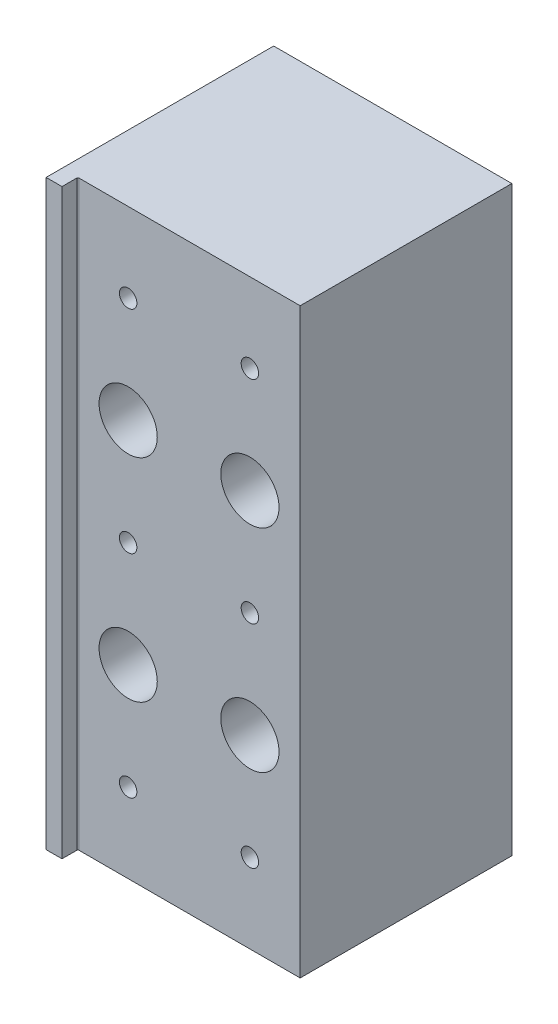
ISO-10303-21;
HEADER;
FILE_DESCRIPTION(('STEP AP214'),'2;1');
FILE_NAME('part.step','',(''),(''),'','','');
FILE_SCHEMA(('AUTOMOTIVE_DESIGN { 1 0 10303 214 1 1 1 1 }'));
ENDSEC;
DATA;
#1=APPLICATION_CONTEXT('core data for automotive mechanical design processes');
#2=APPLICATION_PROTOCOL_DEFINITION('international standard','automotive_design',2000,#1);
#3=PRODUCT_CONTEXT('',#1,'mechanical');
#4=PRODUCT('Part','Part','',(#3));
#5=PRODUCT_RELATED_PRODUCT_CATEGORY('part','',(#4));
#6=PRODUCT_DEFINITION_FORMATION('','',#4);
#7=PRODUCT_DEFINITION_CONTEXT('part definition',#1,'design');
#8=PRODUCT_DEFINITION('design','',#6,#7);
#9=PRODUCT_DEFINITION_SHAPE('','',#8);
#10=(LENGTH_UNIT() NAMED_UNIT(*) SI_UNIT(.MILLI.,.METRE.));
#11=(NAMED_UNIT(*) PLANE_ANGLE_UNIT() SI_UNIT($,.RADIAN.));
#12=(NAMED_UNIT(*) SI_UNIT($,.STERADIAN.) SOLID_ANGLE_UNIT());
#13=UNCERTAINTY_MEASURE_WITH_UNIT(LENGTH_MEASURE(1.E-05),#10,'distance_accuracy_value','');
#14=(GEOMETRIC_REPRESENTATION_CONTEXT(3) GLOBAL_UNCERTAINTY_ASSIGNED_CONTEXT((#13)) GLOBAL_UNIT_ASSIGNED_CONTEXT((#10,
#11,#12)) REPRESENTATION_CONTEXT('',''));
#15=CARTESIAN_POINT('',(0.,0.,0.));
#16=DIRECTION('',(0.,0.,1.));
#17=DIRECTION('',(1.,0.,0.));
#18=AXIS2_PLACEMENT_3D('',#15,#16,#17);
#19=CARTESIAN_POINT('',(45.,110.,40.));
#20=DIRECTION('',(-1.,0.,0.));
#21=DIRECTION('',(0.,0.,1.));
#22=AXIS2_PLACEMENT_3D('',#19,#20,#21);
#23=PLANE('',#22);
#24=DIRECTION('',(0.,0.,-1.));
#25=VECTOR('',#24,1.);
#26=CARTESIAN_POINT('',(45.,0.,40.));
#27=LINE('',#26,#25);
#28=CARTESIAN_POINT('',(45.,0.,40.));
#29=VERTEX_POINT('',#28);
#30=CARTESIAN_POINT('',(45.,0.,0.));
#31=VERTEX_POINT('',#30);
#32=EDGE_CURVE('E220',#29,#31,#27,.T.);
#33=ORIENTED_EDGE('',*,*,#32,.T.);
#34=DIRECTION('',(0.,-1.,0.));
#35=VECTOR('',#34,1.);
#36=CARTESIAN_POINT('',(45.,110.,0.));
#37=LINE('',#36,#35);
#38=CARTESIAN_POINT('',(45.,110.,0.));
#39=VERTEX_POINT('',#38);
#40=EDGE_CURVE('E260',#39,#31,#37,.T.);
#41=ORIENTED_EDGE('',*,*,#40,.F.);
#42=DIRECTION('',(0.,0.,-1.));
#43=VECTOR('',#42,1.);
#44=CARTESIAN_POINT('',(45.,110.,40.));
#45=LINE('',#44,#43);
#46=CARTESIAN_POINT('',(45.,110.,40.));
#47=VERTEX_POINT('',#46);
#48=EDGE_CURVE('E223',#47,#39,#45,.T.);
#49=ORIENTED_EDGE('',*,*,#48,.F.);
#50=DIRECTION('',(0.,-1.,0.));
#51=VECTOR('',#50,1.);
#52=CARTESIAN_POINT('',(45.,110.,40.));
#53=LINE('',#52,#51);
#54=EDGE_CURVE('E237',#47,#29,#53,.T.);
#55=ORIENTED_EDGE('',*,*,#54,.T.);
#56=EDGE_LOOP('',(#33,#41,#49,#55));
#57=FACE_BOUND('',#56,.T.);
#58=ADVANCED_FACE('F54',(#57),#23,.F.);
#59=CARTESIAN_POINT('',(0.,110.,0.));
#60=DIRECTION('',(0.,0.,1.));
#61=DIRECTION('',(1.,0.,0.));
#62=AXIS2_PLACEMENT_3D('',#59,#60,#61);
#63=PLANE('',#62);
#64=CARTESIAN_POINT('',(12.5,35.,0.));
#65=DIRECTION('',(0.,0.,1.));
#66=DIRECTION('',(1.,0.,0.));
#67=AXIS2_PLACEMENT_3D('',#64,#65,#66);
#68=CIRCLE('',#67,3.5);
#69=CARTESIAN_POINT('',(16.,35.,0.));
#70=VERTEX_POINT('',#69);
#71=EDGE_CURVE('E174',#70,#70,#68,.T.);
#72=ORIENTED_EDGE('',*,*,#71,.T.);
#73=EDGE_LOOP('',(#72));
#74=FACE_BOUND('',#73,.T.);
#75=CARTESIAN_POINT('',(35.5,35.,0.));
#76=DIRECTION('',(0.,0.,1.));
#77=DIRECTION('',(1.,0.,0.));
#78=AXIS2_PLACEMENT_3D('',#75,#76,#77);
#79=CIRCLE('',#78,3.5);
#80=CARTESIAN_POINT('',(39.,35.,0.));
#81=VERTEX_POINT('',#80);
#82=EDGE_CURVE('E185',#81,#81,#79,.T.);
#83=ORIENTED_EDGE('',*,*,#82,.T.);
#84=EDGE_LOOP('',(#83));
#85=FACE_BOUND('',#84,.T.);
#86=CARTESIAN_POINT('',(35.5,75.,0.));
#87=DIRECTION('',(0.,0.,1.));
#88=DIRECTION('',(1.,0.,0.));
#89=AXIS2_PLACEMENT_3D('',#86,#87,#88);
#90=CIRCLE('',#89,3.5);
#91=CARTESIAN_POINT('',(39.,75.,0.));
#92=VERTEX_POINT('',#91);
#93=EDGE_CURVE('E179',#92,#92,#90,.T.);
#94=ORIENTED_EDGE('',*,*,#93,.T.);
#95=EDGE_LOOP('',(#94));
#96=FACE_BOUND('',#95,.T.);
#97=CARTESIAN_POINT('',(12.5,75.,0.));
#98=DIRECTION('',(0.,0.,1.));
#99=DIRECTION('',(1.,0.,0.));
#100=AXIS2_PLACEMENT_3D('',#97,#98,#99);
#101=CIRCLE('',#100,3.5);
#102=CARTESIAN_POINT('',(16.,75.,0.));
#103=VERTEX_POINT('',#102);
#104=EDGE_CURVE('E193',#103,#103,#101,.T.);
#105=ORIENTED_EDGE('',*,*,#104,.T.);
#106=EDGE_LOOP('',(#105));
#107=FACE_BOUND('',#106,.T.);
#108=DIRECTION('',(-1.,0.,0.));
#109=VECTOR('',#108,1.);
#110=CARTESIAN_POINT('',(0.,0.,0.));
#111=LINE('',#110,#109);
#112=CARTESIAN_POINT('',(0.,0.,0.));
#113=VERTEX_POINT('',#112);
#114=EDGE_CURVE('E240',#31,#113,#111,.T.);
#115=ORIENTED_EDGE('',*,*,#114,.T.);
#116=DIRECTION('',(0.,-1.,0.));
#117=VECTOR('',#116,1.);
#118=CARTESIAN_POINT('',(0.,110.,0.));
#119=LINE('',#118,#117);
#120=CARTESIAN_POINT('',(0.,110.,0.));
#121=VERTEX_POINT('',#120);
#122=EDGE_CURVE('E257',#121,#113,#119,.T.);
#123=ORIENTED_EDGE('',*,*,#122,.F.);
#124=DIRECTION('',(-1.,0.,0.));
#125=VECTOR('',#124,1.);
#126=CARTESIAN_POINT('',(0.,110.,0.));
#127=LINE('',#126,#125);
#128=EDGE_CURVE('E226',#39,#121,#127,.T.);
#129=ORIENTED_EDGE('',*,*,#128,.F.);
#130=ORIENTED_EDGE('',*,*,#40,.T.);
#131=EDGE_LOOP('',(#115,#123,#129,#130));
#132=FACE_BOUND('',#131,.T.);
#133=ADVANCED_FACE('F293',(#74,#85,#96,#107,#132),#63,.F.);
#134=CARTESIAN_POINT('',(0.,110.,43.));
#135=DIRECTION('',(1.,0.,0.));
#136=DIRECTION('',(0.,0.,-1.));
#137=AXIS2_PLACEMENT_3D('',#134,#135,#136);
#138=PLANE('',#137);
#139=DIRECTION('',(0.,0.,1.));
#140=VECTOR('',#139,1.);
#141=CARTESIAN_POINT('',(0.,0.,43.));
#142=LINE('',#141,#140);
#143=CARTESIAN_POINT('',(0.,0.,43.));
#144=VERTEX_POINT('',#143);
#145=EDGE_CURVE('E242',#113,#144,#142,.T.);
#146=ORIENTED_EDGE('',*,*,#145,.T.);
#147=DIRECTION('',(0.,-1.,0.));
#148=VECTOR('',#147,1.);
#149=CARTESIAN_POINT('',(0.,110.,43.));
#150=LINE('',#149,#148);
#151=CARTESIAN_POINT('',(0.,110.,43.));
#152=VERTEX_POINT('',#151);
#153=EDGE_CURVE('E254',#152,#144,#150,.T.);
#154=ORIENTED_EDGE('',*,*,#153,.F.);
#155=DIRECTION('',(0.,0.,1.));
#156=VECTOR('',#155,1.);
#157=CARTESIAN_POINT('',(0.,110.,43.));
#158=LINE('',#157,#156);
#159=EDGE_CURVE('E229',#121,#152,#158,.T.);
#160=ORIENTED_EDGE('',*,*,#159,.F.);
#161=ORIENTED_EDGE('',*,*,#122,.T.);
#162=EDGE_LOOP('',(#146,#154,#160,#161));
#163=FACE_BOUND('',#162,.T.);
#164=ADVANCED_FACE('F298',(#163),#138,.F.);
#165=CARTESIAN_POINT('',(0.,110.,43.));
#166=DIRECTION('',(0.,0.,-1.));
#167=DIRECTION('',(-1.,0.,0.));
#168=AXIS2_PLACEMENT_3D('',#165,#166,#167);
#169=PLANE('',#168);
#170=DIRECTION('',(1.,0.,0.));
#171=VECTOR('',#170,1.);
#172=CARTESIAN_POINT('',(0.,0.,43.));
#173=LINE('',#172,#171);
#174=CARTESIAN_POINT('',(3.,0.,43.));
#175=VERTEX_POINT('',#174);
#176=EDGE_CURVE('E244',#144,#175,#173,.T.);
#177=ORIENTED_EDGE('',*,*,#176,.T.);
#178=DIRECTION('',(0.,-1.,0.));
#179=VECTOR('',#178,1.);
#180=CARTESIAN_POINT('',(3.,110.,43.));
#181=LINE('',#180,#179);
#182=CARTESIAN_POINT('',(3.,110.,43.));
#183=VERTEX_POINT('',#182);
#184=EDGE_CURVE('E251',#183,#175,#181,.T.);
#185=ORIENTED_EDGE('',*,*,#184,.F.);
#186=DIRECTION('',(1.,0.,0.));
#187=VECTOR('',#186,1.);
#188=CARTESIAN_POINT('',(0.,110.,43.));
#189=LINE('',#188,#187);
#190=EDGE_CURVE('E231',#152,#183,#189,.T.);
#191=ORIENTED_EDGE('',*,*,#190,.F.);
#192=ORIENTED_EDGE('',*,*,#153,.T.);
#193=EDGE_LOOP('',(#177,#185,#191,#192));
#194=FACE_BOUND('',#193,.T.);
#195=ADVANCED_FACE('F303',(#194),#169,.F.);
#196=CARTESIAN_POINT('',(3.,110.,40.));
#197=DIRECTION('',(-1.,0.,0.));
#198=DIRECTION('',(0.,0.,1.));
#199=AXIS2_PLACEMENT_3D('',#196,#197,#198);
#200=PLANE('',#199);
#201=DIRECTION('',(0.,0.,-1.));
#202=VECTOR('',#201,1.);
#203=CARTESIAN_POINT('',(3.,0.,40.));
#204=LINE('',#203,#202);
#205=CARTESIAN_POINT('',(3.,0.,40.2));
#206=VERTEX_POINT('',#205);
#207=EDGE_CURVE('E246',#175,#206,#204,.T.);
#208=ORIENTED_EDGE('',*,*,#207,.T.);
#209=DIRECTION('',(0.,-1.,0.));
#210=VECTOR('',#209,1.);
#211=CARTESIAN_POINT('',(3.,110.,40.2));
#212=LINE('',#211,#210);
#213=CARTESIAN_POINT('',(3.,110.,40.2));
#214=VERTEX_POINT('',#213);
#215=EDGE_CURVE('E69',#206,#214,#212,.F.);
#216=ORIENTED_EDGE('',*,*,#215,.T.);
#217=DIRECTION('',(0.,0.,-1.));
#218=VECTOR('',#217,1.);
#219=CARTESIAN_POINT('',(3.,110.,40.));
#220=LINE('',#219,#218);
#221=EDGE_CURVE('E233',#183,#214,#220,.T.);
#222=ORIENTED_EDGE('',*,*,#221,.F.);
#223=ORIENTED_EDGE('',*,*,#184,.T.);
#224=EDGE_LOOP('',(#208,#216,#222,#223));
#225=FACE_BOUND('',#224,.T.);
#226=ADVANCED_FACE('F307',(#225),#200,.F.);
#227=CARTESIAN_POINT('',(3.,110.,40.));
#228=DIRECTION('',(0.,0.,-1.));
#229=DIRECTION('',(-1.,0.,0.));
#230=AXIS2_PLACEMENT_3D('',#227,#228,#229);
#231=PLANE('',#230);
#232=CARTESIAN_POINT('',(12.5,95.,40.));
#233=DIRECTION('',(0.,0.,1.));
#234=DIRECTION('',(1.,0.,0.));
#235=AXIS2_PLACEMENT_3D('',#232,#233,#234);
#236=CIRCLE('',#235,1.64999999999999);
#237=CARTESIAN_POINT('',(14.15,95.,40.));
#238=VERTEX_POINT('',#237);
#239=EDGE_CURVE('E140',#238,#238,#236,.T.);
#240=ORIENTED_EDGE('',*,*,#239,.F.);
#241=EDGE_LOOP('',(#240));
#242=FACE_BOUND('',#241,.T.);
#243=CARTESIAN_POINT('',(12.5,15.,40.));
#244=DIRECTION('',(0.,0.,1.));
#245=DIRECTION('',(1.,0.,0.));
#246=AXIS2_PLACEMENT_3D('',#243,#244,#245);
#247=CIRCLE('',#246,1.64999999999999);
#248=CARTESIAN_POINT('',(14.15,15.,40.));
#249=VERTEX_POINT('',#248);
#250=EDGE_CURVE('E139',#249,#249,#247,.T.);
#251=ORIENTED_EDGE('',*,*,#250,.F.);
#252=EDGE_LOOP('',(#251));
#253=FACE_BOUND('',#252,.T.);
#254=CARTESIAN_POINT('',(12.5,55.,40.));
#255=DIRECTION('',(0.,0.,1.));
#256=DIRECTION('',(1.,0.,0.));
#257=AXIS2_PLACEMENT_3D('',#254,#255,#256);
#258=CIRCLE('',#257,1.64999999999999);
#259=CARTESIAN_POINT('',(14.15,55.,40.));
#260=VERTEX_POINT('',#259);
#261=EDGE_CURVE('E150',#260,#260,#258,.T.);
#262=ORIENTED_EDGE('',*,*,#261,.F.);
#263=EDGE_LOOP('',(#262));
#264=FACE_BOUND('',#263,.T.);
#265=CARTESIAN_POINT('',(35.5,55.,40.));
#266=DIRECTION('',(0.,0.,1.));
#267=DIRECTION('',(1.,0.,0.));
#268=AXIS2_PLACEMENT_3D('',#265,#266,#267);
#269=CIRCLE('',#268,1.64999999999999);
#270=CARTESIAN_POINT('',(37.15,55.,40.));
#271=VERTEX_POINT('',#270);
#272=EDGE_CURVE('E156',#271,#271,#269,.T.);
#273=ORIENTED_EDGE('',*,*,#272,.F.);
#274=EDGE_LOOP('',(#273));
#275=FACE_BOUND('',#274,.T.);
#276=CARTESIAN_POINT('',(35.5,95.,40.));
#277=DIRECTION('',(0.,0.,1.));
#278=DIRECTION('',(1.,0.,0.));
#279=AXIS2_PLACEMENT_3D('',#276,#277,#278);
#280=CIRCLE('',#279,1.64999999999999);
#281=CARTESIAN_POINT('',(37.15,95.,40.));
#282=VERTEX_POINT('',#281);
#283=EDGE_CURVE('E162',#282,#282,#280,.T.);
#284=ORIENTED_EDGE('',*,*,#283,.F.);
#285=EDGE_LOOP('',(#284));
#286=FACE_BOUND('',#285,.T.);
#287=CARTESIAN_POINT('',(35.5,15.,40.));
#288=DIRECTION('',(0.,0.,1.));
#289=DIRECTION('',(1.,0.,0.));
#290=AXIS2_PLACEMENT_3D('',#287,#288,#289);
#291=CIRCLE('',#290,1.64999999999999);
#292=CARTESIAN_POINT('',(37.15,15.,40.));
#293=VERTEX_POINT('',#292);
#294=EDGE_CURVE('E168',#293,#293,#291,.T.);
#295=ORIENTED_EDGE('',*,*,#294,.F.);
#296=EDGE_LOOP('',(#295));
#297=FACE_BOUND('',#296,.T.);
#298=CARTESIAN_POINT('',(35.5,75.,40.));
#299=DIRECTION('',(0.,0.,1.));
#300=DIRECTION('',(1.,0.,0.));
#301=AXIS2_PLACEMENT_3D('',#298,#299,#300);
#302=CIRCLE('',#301,5.5);
#303=CARTESIAN_POINT('',(41.,75.,40.));
#304=VERTEX_POINT('',#303);
#305=EDGE_CURVE('E205',#304,#304,#302,.T.);
#306=ORIENTED_EDGE('',*,*,#305,.F.);
#307=EDGE_LOOP('',(#306));
#308=FACE_BOUND('',#307,.T.);
#309=CARTESIAN_POINT('',(12.5,35.,40.));
#310=DIRECTION('',(0.,0.,1.));
#311=DIRECTION('',(1.,0.,0.));
#312=AXIS2_PLACEMENT_3D('',#309,#310,#311);
#313=CIRCLE('',#312,5.5);
#314=CARTESIAN_POINT('',(18.,35.,40.));
#315=VERTEX_POINT('',#314);
#316=EDGE_CURVE('E212',#315,#315,#313,.T.);
#317=ORIENTED_EDGE('',*,*,#316,.F.);
#318=EDGE_LOOP('',(#317));
#319=FACE_BOUND('',#318,.T.);
#320=CARTESIAN_POINT('',(35.5,35.,40.));
#321=DIRECTION('',(0.,0.,1.));
#322=DIRECTION('',(1.,0.,0.));
#323=AXIS2_PLACEMENT_3D('',#320,#321,#322);
#324=CIRCLE('',#323,5.5);
#325=CARTESIAN_POINT('',(41.,35.,40.));
#326=VERTEX_POINT('',#325);
#327=EDGE_CURVE('E199',#326,#326,#324,.T.);
#328=ORIENTED_EDGE('',*,*,#327,.F.);
#329=EDGE_LOOP('',(#328));
#330=FACE_BOUND('',#329,.T.);
#331=CARTESIAN_POINT('',(12.5,75.,40.));
#332=DIRECTION('',(0.,0.,1.));
#333=DIRECTION('',(1.,0.,0.));
#334=AXIS2_PLACEMENT_3D('',#331,#332,#333);
#335=CIRCLE('',#334,5.5);
#336=CARTESIAN_POINT('',(18.,75.,40.));
#337=VERTEX_POINT('',#336);
#338=EDGE_CURVE('E208',#337,#337,#335,.T.);
#339=ORIENTED_EDGE('',*,*,#338,.F.);
#340=EDGE_LOOP('',(#339));
#341=FACE_BOUND('',#340,.T.);
#342=DIRECTION('',(1.,0.,0.));
#343=VECTOR('',#342,1.);
#344=CARTESIAN_POINT('',(3.,110.,40.));
#345=LINE('',#344,#343);
#346=CARTESIAN_POINT('',(3.2,110.,40.));
#347=VERTEX_POINT('',#346);
#348=EDGE_CURVE('E235',#347,#47,#345,.T.);
#349=ORIENTED_EDGE('',*,*,#348,.F.);
#350=DIRECTION('',(0.,-1.,0.));
#351=VECTOR('',#350,1.);
#352=CARTESIAN_POINT('',(3.2,0.,40.));
#353=LINE('',#352,#351);
#354=CARTESIAN_POINT('',(3.2,0.,40.));
#355=VERTEX_POINT('',#354);
#356=EDGE_CURVE('E263',#347,#355,#353,.T.);
#357=ORIENTED_EDGE('',*,*,#356,.T.);
#358=DIRECTION('',(1.,0.,0.));
#359=VECTOR('',#358,1.);
#360=CARTESIAN_POINT('',(3.,0.,40.));
#361=LINE('',#360,#359);
#362=EDGE_CURVE('E227',#355,#29,#361,.T.);
#363=ORIENTED_EDGE('',*,*,#362,.T.);
#364=ORIENTED_EDGE('',*,*,#54,.F.);
#365=EDGE_LOOP('',(#349,#357,#363,#364));
#366=FACE_BOUND('',#365,.T.);
#367=ADVANCED_FACE('F269',(#242,#253,#264,#275,#286,#297,#308,#319,#330,#341,#366),#231,.F.);
#368=CARTESIAN_POINT('',(0.,110.,0.));
#369=DIRECTION('',(0.,-1.,0.));
#370=DIRECTION('',(0.,0.,-1.));
#371=AXIS2_PLACEMENT_3D('',#368,#369,#370);
#372=PLANE('',#371);
#373=ORIENTED_EDGE('',*,*,#48,.T.);
#374=ORIENTED_EDGE('',*,*,#128,.T.);
#375=ORIENTED_EDGE('',*,*,#159,.T.);
#376=ORIENTED_EDGE('',*,*,#190,.T.);
#377=ORIENTED_EDGE('',*,*,#221,.T.);
#378=CARTESIAN_POINT('',(3.2,110.,40.2));
#379=DIRECTION('',(0.,-1.,0.));
#380=DIRECTION('',(0.,0.,-1.));
#381=AXIS2_PLACEMENT_3D('',#378,#379,#380);
#382=CIRCLE('',#381,0.2);
#383=EDGE_CURVE('E11',#214,#347,#382,.T.);
#384=ORIENTED_EDGE('',*,*,#383,.T.);
#385=ORIENTED_EDGE('',*,*,#348,.T.);
#386=EDGE_LOOP('',(#373,#374,#375,#376,#377,#384,#385));
#387=FACE_BOUND('',#386,.T.);
#388=ADVANCED_FACE('F280',(#387),#372,.F.);
#389=CARTESIAN_POINT('',(0.,0.,0.));
#390=DIRECTION('',(0.,-1.,0.));
#391=DIRECTION('',(0.,0.,-1.));
#392=AXIS2_PLACEMENT_3D('',#389,#390,#391);
#393=PLANE('',#392);
#394=ORIENTED_EDGE('',*,*,#32,.F.);
#395=ORIENTED_EDGE('',*,*,#362,.F.);
#396=CARTESIAN_POINT('',(3.2,0.,40.2));
#397=DIRECTION('',(0.,-1.,0.));
#398=DIRECTION('',(0.,0.,-1.));
#399=AXIS2_PLACEMENT_3D('',#396,#397,#398);
#400=CIRCLE('',#399,0.2);
#401=EDGE_CURVE('E62',#355,#206,#400,.F.);
#402=ORIENTED_EDGE('',*,*,#401,.T.);
#403=ORIENTED_EDGE('',*,*,#207,.F.);
#404=ORIENTED_EDGE('',*,*,#176,.F.);
#405=ORIENTED_EDGE('',*,*,#145,.F.);
#406=ORIENTED_EDGE('',*,*,#114,.F.);
#407=EDGE_LOOP('',(#394,#395,#402,#403,#404,#405,#406));
#408=FACE_BOUND('',#407,.T.);
#409=ADVANCED_FACE('F274',(#408),#393,.T.);
#410=CARTESIAN_POINT('',(3.2,110.,40.2));
#411=DIRECTION('',(0.,1.,0.));
#412=DIRECTION('',(0.,0.,1.));
#413=AXIS2_PLACEMENT_3D('',#410,#411,#412);
#414=CYLINDRICAL_SURFACE('',#413,0.2);
#415=ORIENTED_EDGE('',*,*,#383,.F.);
#416=ORIENTED_EDGE('',*,*,#215,.F.);
#417=ORIENTED_EDGE('',*,*,#401,.F.);
#418=ORIENTED_EDGE('',*,*,#356,.F.);
#419=EDGE_LOOP('',(#415,#416,#417,#418));
#420=FACE_BOUND('',#419,.T.);
#421=ADVANCED_FACE('F56',(#420),#414,.F.);
#422=CARTESIAN_POINT('',(12.5,75.,32.));
#423=DIRECTION('',(0.,0.,1.));
#424=DIRECTION('',(1.,0.,0.));
#425=AXIS2_PLACEMENT_3D('',#422,#423,#424);
#426=CYLINDRICAL_SURFACE('',#425,5.5);
#427=CARTESIAN_POINT('',(12.5,75.,32.));
#428=DIRECTION('',(0.,0.,1.));
#429=DIRECTION('',(1.,0.,0.));
#430=AXIS2_PLACEMENT_3D('',#427,#428,#429);
#431=CIRCLE('',#430,5.5);
#432=CARTESIAN_POINT('',(18.,75.,32.));
#433=VERTEX_POINT('',#432);
#434=EDGE_CURVE('E217',#433,#433,#431,.T.);
#435=ORIENTED_EDGE('',*,*,#434,.F.);
#436=EDGE_LOOP('',(#435));
#437=FACE_BOUND('',#436,.T.);
#438=ORIENTED_EDGE('',*,*,#338,.T.);
#439=EDGE_LOOP('',(#438));
#440=FACE_BOUND('',#439,.T.);
#441=ADVANCED_FACE('F283',(#437,#440),#426,.F.);
#442=CARTESIAN_POINT('',(12.5,75.,32.));
#443=DIRECTION('',(0.,0.,1.));
#444=DIRECTION('',(1.,0.,0.));
#445=AXIS2_PLACEMENT_3D('',#442,#443,#444);
#446=PLANE('',#445);
#447=CARTESIAN_POINT('',(12.5,75.,32.));
#448=DIRECTION('',(0.,0.,1.));
#449=DIRECTION('',(1.,0.,0.));
#450=AXIS2_PLACEMENT_3D('',#447,#448,#449);
#451=CIRCLE('',#450,3.5);
#452=CARTESIAN_POINT('',(16.,75.,32.));
#453=VERTEX_POINT('',#452);
#454=EDGE_CURVE('E178',#453,#453,#451,.T.);
#455=ORIENTED_EDGE('',*,*,#454,.F.);
#456=EDGE_LOOP('',(#455));
#457=FACE_BOUND('',#456,.T.);
#458=ORIENTED_EDGE('',*,*,#434,.T.);
#459=EDGE_LOOP('',(#458));
#460=FACE_BOUND('',#459,.T.);
#461=ADVANCED_FACE('F288',(#457,#460),#446,.T.);
#462=CARTESIAN_POINT('',(35.5,35.,32.));
#463=DIRECTION('',(0.,0.,1.));
#464=DIRECTION('',(1.,0.,0.));
#465=AXIS2_PLACEMENT_3D('',#462,#463,#464);
#466=CYLINDRICAL_SURFACE('',#465,5.5);
#467=CARTESIAN_POINT('',(35.5,35.,32.));
#468=DIRECTION('',(0.,0.,1.));
#469=DIRECTION('',(1.,0.,0.));
#470=AXIS2_PLACEMENT_3D('',#467,#468,#469);
#471=CIRCLE('',#470,5.5);
#472=CARTESIAN_POINT('',(41.,35.,32.));
#473=VERTEX_POINT('',#472);
#474=EDGE_CURVE('E196',#473,#473,#471,.T.);
#475=ORIENTED_EDGE('',*,*,#474,.F.);
#476=EDGE_LOOP('',(#475));
#477=FACE_BOUND('',#476,.T.);
#478=ORIENTED_EDGE('',*,*,#327,.T.);
#479=EDGE_LOOP('',(#478));
#480=FACE_BOUND('',#479,.T.);
#481=ADVANCED_FACE('F318',(#477,#480),#466,.F.);
#482=CARTESIAN_POINT('',(35.5,35.,32.));
#483=DIRECTION('',(0.,0.,1.));
#484=DIRECTION('',(1.,0.,0.));
#485=AXIS2_PLACEMENT_3D('',#482,#483,#484);
#486=PLANE('',#485);
#487=CARTESIAN_POINT('',(35.5,35.,32.));
#488=DIRECTION('',(0.,0.,1.));
#489=DIRECTION('',(1.,0.,0.));
#490=AXIS2_PLACEMENT_3D('',#487,#488,#489);
#491=CIRCLE('',#490,3.5);
#492=CARTESIAN_POINT('',(39.,35.,32.));
#493=VERTEX_POINT('',#492);
#494=EDGE_CURVE('E182',#493,#493,#491,.T.);
#495=ORIENTED_EDGE('',*,*,#494,.F.);
#496=EDGE_LOOP('',(#495));
#497=FACE_BOUND('',#496,.T.);
#498=ORIENTED_EDGE('',*,*,#474,.T.);
#499=EDGE_LOOP('',(#498));
#500=FACE_BOUND('',#499,.T.);
#501=ADVANCED_FACE('F328',(#497,#500),#486,.T.);
#502=CARTESIAN_POINT('',(12.5,35.,32.));
#503=DIRECTION('',(0.,0.,1.));
#504=DIRECTION('',(1.,0.,0.));
#505=AXIS2_PLACEMENT_3D('',#502,#503,#504);
#506=CYLINDRICAL_SURFACE('',#505,5.5);
#507=CARTESIAN_POINT('',(12.5,35.,32.));
#508=DIRECTION('',(0.,0.,1.));
#509=DIRECTION('',(1.,0.,0.));
#510=AXIS2_PLACEMENT_3D('',#507,#508,#509);
#511=CIRCLE('',#510,5.5);
#512=CARTESIAN_POINT('',(18.,35.,32.));
#513=VERTEX_POINT('',#512);
#514=EDGE_CURVE('E202',#513,#513,#511,.T.);
#515=ORIENTED_EDGE('',*,*,#514,.F.);
#516=EDGE_LOOP('',(#515));
#517=FACE_BOUND('',#516,.T.);
#518=ORIENTED_EDGE('',*,*,#316,.T.);
#519=EDGE_LOOP('',(#518));
#520=FACE_BOUND('',#519,.T.);
#521=ADVANCED_FACE('F324',(#517,#520),#506,.F.);
#522=CARTESIAN_POINT('',(12.5,35.,32.));
#523=DIRECTION('',(0.,0.,1.));
#524=DIRECTION('',(1.,0.,0.));
#525=AXIS2_PLACEMENT_3D('',#522,#523,#524);
#526=PLANE('',#525);
#527=CARTESIAN_POINT('',(12.5,35.,32.));
#528=DIRECTION('',(0.,0.,1.));
#529=DIRECTION('',(1.,0.,0.));
#530=AXIS2_PLACEMENT_3D('',#527,#528,#529);
#531=CIRCLE('',#530,3.5);
#532=CARTESIAN_POINT('',(16.,35.,32.));
#533=VERTEX_POINT('',#532);
#534=EDGE_CURVE('E188',#533,#533,#531,.T.);
#535=ORIENTED_EDGE('',*,*,#534,.F.);
#536=EDGE_LOOP('',(#535));
#537=FACE_BOUND('',#536,.T.);
#538=ORIENTED_EDGE('',*,*,#514,.T.);
#539=EDGE_LOOP('',(#538));
#540=FACE_BOUND('',#539,.T.);
#541=ADVANCED_FACE('F320',(#537,#540),#526,.T.);
#542=CARTESIAN_POINT('',(35.5,75.,32.));
#543=DIRECTION('',(0.,0.,1.));
#544=DIRECTION('',(1.,0.,0.));
#545=AXIS2_PLACEMENT_3D('',#542,#543,#544);
#546=CYLINDRICAL_SURFACE('',#545,5.5);
#547=CARTESIAN_POINT('',(35.5,75.,32.));
#548=DIRECTION('',(0.,0.,1.));
#549=DIRECTION('',(1.,0.,0.));
#550=AXIS2_PLACEMENT_3D('',#547,#548,#549);
#551=CIRCLE('',#550,5.5);
#552=CARTESIAN_POINT('',(41.,75.,32.));
#553=VERTEX_POINT('',#552);
#554=EDGE_CURVE('E209',#553,#553,#551,.T.);
#555=ORIENTED_EDGE('',*,*,#554,.F.);
#556=EDGE_LOOP('',(#555));
#557=FACE_BOUND('',#556,.T.);
#558=ORIENTED_EDGE('',*,*,#305,.T.);
#559=EDGE_LOOP('',(#558));
#560=FACE_BOUND('',#559,.T.);
#561=ADVANCED_FACE('F323',(#557,#560),#546,.F.);
#562=CARTESIAN_POINT('',(35.5,75.,32.));
#563=DIRECTION('',(0.,0.,1.));
#564=DIRECTION('',(1.,0.,0.));
#565=AXIS2_PLACEMENT_3D('',#562,#563,#564);
#566=PLANE('',#565);
#567=CARTESIAN_POINT('',(35.5,75.,32.));
#568=DIRECTION('',(0.,0.,1.));
#569=DIRECTION('',(1.,0.,0.));
#570=AXIS2_PLACEMENT_3D('',#567,#568,#569);
#571=CIRCLE('',#570,3.5);
#572=CARTESIAN_POINT('',(39.,75.,32.));
#573=VERTEX_POINT('',#572);
#574=EDGE_CURVE('E175',#573,#573,#571,.T.);
#575=ORIENTED_EDGE('',*,*,#574,.F.);
#576=EDGE_LOOP('',(#575));
#577=FACE_BOUND('',#576,.T.);
#578=ORIENTED_EDGE('',*,*,#554,.T.);
#579=EDGE_LOOP('',(#578));
#580=FACE_BOUND('',#579,.T.);
#581=ADVANCED_FACE('F330',(#577,#580),#566,.T.);
#582=CARTESIAN_POINT('',(12.5,75.,0.));
#583=DIRECTION('',(0.,0.,1.));
#584=DIRECTION('',(1.,0.,0.));
#585=AXIS2_PLACEMENT_3D('',#582,#583,#584);
#586=CYLINDRICAL_SURFACE('',#585,3.5);
#587=ORIENTED_EDGE('',*,*,#104,.F.);
#588=EDGE_LOOP('',(#587));
#589=FACE_BOUND('',#588,.T.);
#590=ORIENTED_EDGE('',*,*,#454,.T.);
#591=EDGE_LOOP('',(#590));
#592=FACE_BOUND('',#591,.T.);
#593=ADVANCED_FACE('F333',(#589,#592),#586,.F.);
#594=CARTESIAN_POINT('',(35.5,75.,0.));
#595=DIRECTION('',(0.,0.,1.));
#596=DIRECTION('',(1.,0.,0.));
#597=AXIS2_PLACEMENT_3D('',#594,#595,#596);
#598=CYLINDRICAL_SURFACE('',#597,3.5);
#599=ORIENTED_EDGE('',*,*,#93,.F.);
#600=EDGE_LOOP('',(#599));
#601=FACE_BOUND('',#600,.T.);
#602=ORIENTED_EDGE('',*,*,#574,.T.);
#603=EDGE_LOOP('',(#602));
#604=FACE_BOUND('',#603,.T.);
#605=ADVANCED_FACE('F346',(#601,#604),#598,.F.);
#606=CARTESIAN_POINT('',(35.5,35.,0.));
#607=DIRECTION('',(0.,0.,1.));
#608=DIRECTION('',(1.,0.,0.));
#609=AXIS2_PLACEMENT_3D('',#606,#607,#608);
#610=CYLINDRICAL_SURFACE('',#609,3.5);
#611=ORIENTED_EDGE('',*,*,#82,.F.);
#612=EDGE_LOOP('',(#611));
#613=FACE_BOUND('',#612,.T.);
#614=ORIENTED_EDGE('',*,*,#494,.T.);
#615=EDGE_LOOP('',(#614));
#616=FACE_BOUND('',#615,.T.);
#617=ADVANCED_FACE('F352',(#613,#616),#610,.F.);
#618=CARTESIAN_POINT('',(12.5,35.,0.));
#619=DIRECTION('',(0.,0.,1.));
#620=DIRECTION('',(1.,0.,0.));
#621=AXIS2_PLACEMENT_3D('',#618,#619,#620);
#622=CYLINDRICAL_SURFACE('',#621,3.5);
#623=ORIENTED_EDGE('',*,*,#71,.F.);
#624=EDGE_LOOP('',(#623));
#625=FACE_BOUND('',#624,.T.);
#626=ORIENTED_EDGE('',*,*,#534,.T.);
#627=EDGE_LOOP('',(#626));
#628=FACE_BOUND('',#627,.T.);
#629=ADVANCED_FACE('F348',(#625,#628),#622,.F.);
#630=CARTESIAN_POINT('',(35.5,15.,23.5));
#631=DIRECTION('',(0.,0.,1.));
#632=DIRECTION('',(1.,0.,0.));
#633=AXIS2_PLACEMENT_3D('',#630,#631,#632);
#634=CONICAL_SURFACE('',#633,1.65,1.02974425867665);
#635=CARTESIAN_POINT('',(35.5,15.,22.5085799786045));
#636=VERTEX_POINT('',#635);
#637=VERTEX_LOOP('',#636);
#638=FACE_BOUND('',#637,.T.);
#639=CARTESIAN_POINT('',(35.5,15.,23.5));
#640=DIRECTION('',(0.,0.,1.));
#641=DIRECTION('',(1.,0.,0.));
#642=AXIS2_PLACEMENT_3D('',#639,#640,#641);
#643=CIRCLE('',#642,1.65);
#644=CARTESIAN_POINT('',(37.15,15.,23.5));
#645=VERTEX_POINT('',#644);
#646=EDGE_CURVE('E171',#645,#645,#643,.T.);
#647=ORIENTED_EDGE('',*,*,#646,.T.);
#648=EDGE_LOOP('',(#647));
#649=FACE_BOUND('',#648,.T.);
#650=ADVANCED_FACE('F351',(#638,#649),#634,.F.);
#651=CARTESIAN_POINT('',(35.5,15.,40.));
#652=DIRECTION('',(0.,0.,1.));
#653=DIRECTION('',(1.,0.,0.));
#654=AXIS2_PLACEMENT_3D('',#651,#652,#653);
#655=CYLINDRICAL_SURFACE('',#654,1.65);
#656=ORIENTED_EDGE('',*,*,#646,.F.);
#657=EDGE_LOOP('',(#656));
#658=FACE_BOUND('',#657,.T.);
#659=ORIENTED_EDGE('',*,*,#294,.T.);
#660=EDGE_LOOP('',(#659));
#661=FACE_BOUND('',#660,.T.);
#662=ADVANCED_FACE('F362',(#658,#661),#655,.F.);
#663=CARTESIAN_POINT('',(35.5,95.,23.5));
#664=DIRECTION('',(0.,0.,1.));
#665=DIRECTION('',(1.,0.,0.));
#666=AXIS2_PLACEMENT_3D('',#663,#664,#665);
#667=CONICAL_SURFACE('',#666,1.65,1.02974425867665);
#668=CARTESIAN_POINT('',(35.5,95.,22.5085799786045));
#669=VERTEX_POINT('',#668);
#670=VERTEX_LOOP('',#669);
#671=FACE_BOUND('',#670,.T.);
#672=CARTESIAN_POINT('',(35.5,95.,23.5));
#673=DIRECTION('',(0.,0.,1.));
#674=DIRECTION('',(1.,0.,0.));
#675=AXIS2_PLACEMENT_3D('',#672,#673,#674);
#676=CIRCLE('',#675,1.65);
#677=CARTESIAN_POINT('',(37.15,95.,23.5));
#678=VERTEX_POINT('',#677);
#679=EDGE_CURVE('E165',#678,#678,#676,.T.);
#680=ORIENTED_EDGE('',*,*,#679,.T.);
#681=EDGE_LOOP('',(#680));
#682=FACE_BOUND('',#681,.T.);
#683=ADVANCED_FACE('F366',(#671,#682),#667,.F.);
#684=CARTESIAN_POINT('',(35.5,95.,40.));
#685=DIRECTION('',(0.,0.,1.));
#686=DIRECTION('',(1.,0.,0.));
#687=AXIS2_PLACEMENT_3D('',#684,#685,#686);
#688=CYLINDRICAL_SURFACE('',#687,1.65);
#689=ORIENTED_EDGE('',*,*,#679,.F.);
#690=EDGE_LOOP('',(#689));
#691=FACE_BOUND('',#690,.T.);
#692=ORIENTED_EDGE('',*,*,#283,.T.);
#693=EDGE_LOOP('',(#692));
#694=FACE_BOUND('',#693,.T.);
#695=ADVANCED_FACE('F370',(#691,#694),#688,.F.);
#696=CARTESIAN_POINT('',(35.5,55.,23.5));
#697=DIRECTION('',(0.,0.,1.));
#698=DIRECTION('',(1.,0.,0.));
#699=AXIS2_PLACEMENT_3D('',#696,#697,#698);
#700=CONICAL_SURFACE('',#699,1.65,1.02974425867665);
#701=CARTESIAN_POINT('',(35.5,55.,22.5085799786045));
#702=VERTEX_POINT('',#701);
#703=VERTEX_LOOP('',#702);
#704=FACE_BOUND('',#703,.T.);
#705=CARTESIAN_POINT('',(35.5,55.,23.5));
#706=DIRECTION('',(0.,0.,1.));
#707=DIRECTION('',(1.,0.,0.));
#708=AXIS2_PLACEMENT_3D('',#705,#706,#707);
#709=CIRCLE('',#708,1.65);
#710=CARTESIAN_POINT('',(37.15,55.,23.5));
#711=VERTEX_POINT('',#710);
#712=EDGE_CURVE('E159',#711,#711,#709,.T.);
#713=ORIENTED_EDGE('',*,*,#712,.T.);
#714=EDGE_LOOP('',(#713));
#715=FACE_BOUND('',#714,.T.);
#716=ADVANCED_FACE('F374',(#704,#715),#700,.F.);
#717=CARTESIAN_POINT('',(35.5,55.,40.));
#718=DIRECTION('',(0.,0.,1.));
#719=DIRECTION('',(1.,0.,0.));
#720=AXIS2_PLACEMENT_3D('',#717,#718,#719);
#721=CYLINDRICAL_SURFACE('',#720,1.65);
#722=ORIENTED_EDGE('',*,*,#712,.F.);
#723=EDGE_LOOP('',(#722));
#724=FACE_BOUND('',#723,.T.);
#725=ORIENTED_EDGE('',*,*,#272,.T.);
#726=EDGE_LOOP('',(#725));
#727=FACE_BOUND('',#726,.T.);
#728=ADVANCED_FACE('F378',(#724,#727),#721,.F.);
#729=CARTESIAN_POINT('',(12.5,55.,23.5));
#730=DIRECTION('',(0.,0.,1.));
#731=DIRECTION('',(1.,0.,0.));
#732=AXIS2_PLACEMENT_3D('',#729,#730,#731);
#733=CONICAL_SURFACE('',#732,1.65,1.02974425867665);
#734=CARTESIAN_POINT('',(12.5,55.,22.5085799786045));
#735=VERTEX_POINT('',#734);
#736=VERTEX_LOOP('',#735);
#737=FACE_BOUND('',#736,.T.);
#738=CARTESIAN_POINT('',(12.5,55.,23.5));
#739=DIRECTION('',(0.,0.,1.));
#740=DIRECTION('',(1.,0.,0.));
#741=AXIS2_PLACEMENT_3D('',#738,#739,#740);
#742=CIRCLE('',#741,1.65);
#743=CARTESIAN_POINT('',(14.15,55.,23.5));
#744=VERTEX_POINT('',#743);
#745=EDGE_CURVE('E153',#744,#744,#742,.T.);
#746=ORIENTED_EDGE('',*,*,#745,.T.);
#747=EDGE_LOOP('',(#746));
#748=FACE_BOUND('',#747,.T.);
#749=ADVANCED_FACE('F382',(#737,#748),#733,.F.);
#750=CARTESIAN_POINT('',(12.5,55.,40.));
#751=DIRECTION('',(0.,0.,1.));
#752=DIRECTION('',(1.,0.,0.));
#753=AXIS2_PLACEMENT_3D('',#750,#751,#752);
#754=CYLINDRICAL_SURFACE('',#753,1.64999999999999);
#755=ORIENTED_EDGE('',*,*,#745,.F.);
#756=EDGE_LOOP('',(#755));
#757=FACE_BOUND('',#756,.T.);
#758=ORIENTED_EDGE('',*,*,#261,.T.);
#759=EDGE_LOOP('',(#758));
#760=FACE_BOUND('',#759,.T.);
#761=ADVANCED_FACE('F386',(#757,#760),#754,.F.);
#762=CARTESIAN_POINT('',(12.5,15.,23.5));
#763=DIRECTION('',(0.,0.,1.));
#764=DIRECTION('',(1.,0.,0.));
#765=AXIS2_PLACEMENT_3D('',#762,#763,#764);
#766=CONICAL_SURFACE('',#765,1.65,1.02974425867665);
#767=CARTESIAN_POINT('',(12.5,15.,22.5085799786045));
#768=VERTEX_POINT('',#767);
#769=VERTEX_LOOP('',#768);
#770=FACE_BOUND('',#769,.T.);
#771=CARTESIAN_POINT('',(12.5,15.,23.5));
#772=DIRECTION('',(0.,0.,1.));
#773=DIRECTION('',(1.,0.,0.));
#774=AXIS2_PLACEMENT_3D('',#771,#772,#773);
#775=CIRCLE('',#774,1.65);
#776=CARTESIAN_POINT('',(14.15,15.,23.5));
#777=VERTEX_POINT('',#776);
#778=EDGE_CURVE('E143',#777,#777,#775,.T.);
#779=ORIENTED_EDGE('',*,*,#778,.T.);
#780=EDGE_LOOP('',(#779));
#781=FACE_BOUND('',#780,.T.);
#782=ADVANCED_FACE('F390',(#770,#781),#766,.F.);
#783=CARTESIAN_POINT('',(12.5,15.,40.));
#784=DIRECTION('',(0.,0.,1.));
#785=DIRECTION('',(1.,0.,0.));
#786=AXIS2_PLACEMENT_3D('',#783,#784,#785);
#787=CYLINDRICAL_SURFACE('',#786,1.64999999999999);
#788=ORIENTED_EDGE('',*,*,#778,.F.);
#789=EDGE_LOOP('',(#788));
#790=FACE_BOUND('',#789,.T.);
#791=ORIENTED_EDGE('',*,*,#250,.T.);
#792=EDGE_LOOP('',(#791));
#793=FACE_BOUND('',#792,.T.);
#794=ADVANCED_FACE('F133',(#790,#793),#787,.F.);
#795=CARTESIAN_POINT('',(12.5,95.,23.5));
#796=DIRECTION('',(0.,0.,1.));
#797=DIRECTION('',(1.,0.,0.));
#798=AXIS2_PLACEMENT_3D('',#795,#796,#797);
#799=CONICAL_SURFACE('',#798,1.65,1.02974425867665);
#800=CARTESIAN_POINT('',(12.5,95.,22.5085799786045));
#801=VERTEX_POINT('',#800);
#802=VERTEX_LOOP('',#801);
#803=FACE_BOUND('',#802,.T.);
#804=CARTESIAN_POINT('',(12.5,95.,23.5));
#805=DIRECTION('',(0.,0.,1.));
#806=DIRECTION('',(1.,0.,0.));
#807=AXIS2_PLACEMENT_3D('',#804,#805,#806);
#808=CIRCLE('',#807,1.65);
#809=CARTESIAN_POINT('',(14.15,95.,23.5));
#810=VERTEX_POINT('',#809);
#811=EDGE_CURVE('E137',#810,#810,#808,.T.);
#812=ORIENTED_EDGE('',*,*,#811,.T.);
#813=EDGE_LOOP('',(#812));
#814=FACE_BOUND('',#813,.T.);
#815=ADVANCED_FACE('F129',(#803,#814),#799,.F.);
#816=CARTESIAN_POINT('',(12.5,95.,40.));
#817=DIRECTION('',(0.,0.,1.));
#818=DIRECTION('',(1.,0.,0.));
#819=AXIS2_PLACEMENT_3D('',#816,#817,#818);
#820=CYLINDRICAL_SURFACE('',#819,1.64999999999999);
#821=ORIENTED_EDGE('',*,*,#811,.F.);
#822=EDGE_LOOP('',(#821));
#823=FACE_BOUND('',#822,.T.);
#824=ORIENTED_EDGE('',*,*,#239,.T.);
#825=EDGE_LOOP('',(#824));
#826=FACE_BOUND('',#825,.T.);
#827=ADVANCED_FACE('F132',(#823,#826),#820,.F.);
#828=CLOSED_SHELL('',(#58,#133,#164,#195,#226,#367,#388,#409,#421,#441,#461,#481,#501,#521,#541,
#561,#581,#593,#605,#617,#629,#650,#662,#683,#695,#716,#728,#749,#761,#782,#794,#815,#827));
#829=MANIFOLD_SOLID_BREP('B2',#828);
#830=ADVANCED_BREP_SHAPE_REPRESENTATION('',(#18,#829),#14);
#831=SHAPE_DEFINITION_REPRESENTATION(#9,#830);
ENDSEC;
END-ISO-10303-21;
